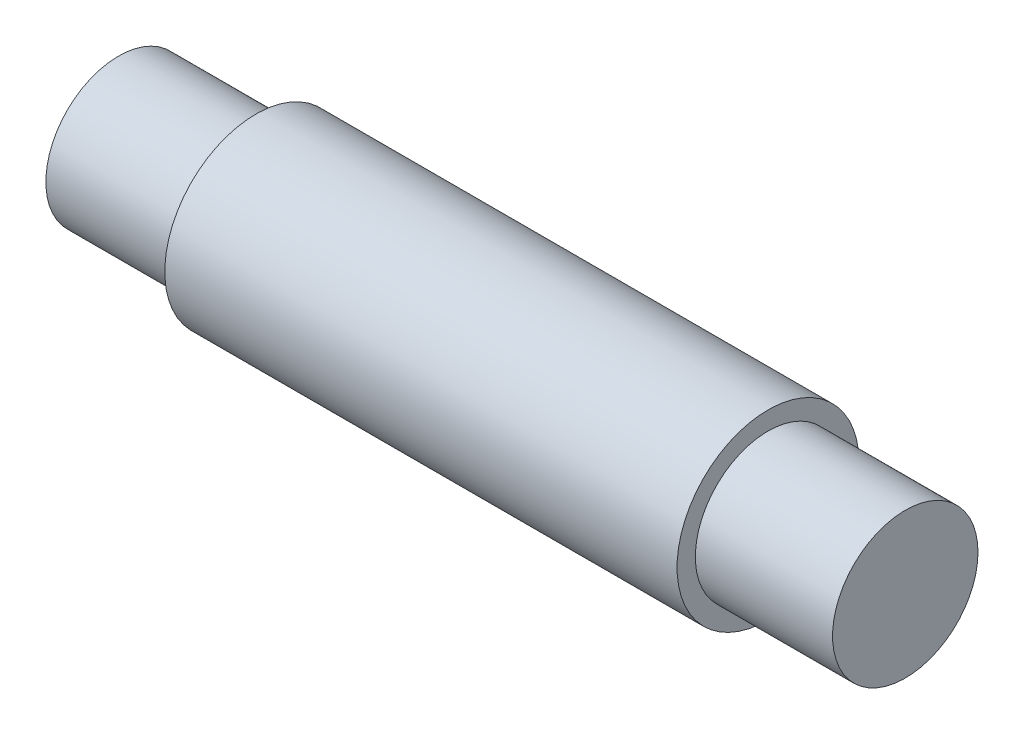
ISO-10303-21;
HEADER;
FILE_DESCRIPTION(('STEP AP214'),'2;1');
FILE_NAME('part.step','',(''),(''),'','','');
FILE_SCHEMA(('AUTOMOTIVE_DESIGN { 1 0 10303 214 1 1 1 1 }'));
ENDSEC;
DATA;
#1=APPLICATION_CONTEXT('core data for automotive mechanical design processes');
#2=APPLICATION_PROTOCOL_DEFINITION('international standard','automotive_design',2000,#1);
#3=PRODUCT_CONTEXT('',#1,'mechanical');
#4=PRODUCT('Part','Part','',(#3));
#5=PRODUCT_RELATED_PRODUCT_CATEGORY('part','',(#4));
#6=PRODUCT_DEFINITION_FORMATION('','',#4);
#7=PRODUCT_DEFINITION_CONTEXT('part definition',#1,'design');
#8=PRODUCT_DEFINITION('design','',#6,#7);
#9=PRODUCT_DEFINITION_SHAPE('','',#8);
#10=(LENGTH_UNIT() NAMED_UNIT(*) SI_UNIT(.MILLI.,.METRE.));
#11=(NAMED_UNIT(*) PLANE_ANGLE_UNIT() SI_UNIT($,.RADIAN.));
#12=(NAMED_UNIT(*) SI_UNIT($,.STERADIAN.) SOLID_ANGLE_UNIT());
#13=UNCERTAINTY_MEASURE_WITH_UNIT(LENGTH_MEASURE(1.E-05),#10,'distance_accuracy_value','');
#14=(GEOMETRIC_REPRESENTATION_CONTEXT(3) GLOBAL_UNCERTAINTY_ASSIGNED_CONTEXT((#13)) GLOBAL_UNIT_ASSIGNED_CONTEXT((#10,
#11,#12)) REPRESENTATION_CONTEXT('',''));
#15=CARTESIAN_POINT('',(0.,0.,0.));
#16=DIRECTION('',(0.,0.,1.));
#17=DIRECTION('',(1.,0.,0.));
#18=AXIS2_PLACEMENT_3D('',#15,#16,#17);
#19=CARTESIAN_POINT('',(-43.,0.,0.));
#20=DIRECTION('',(-1.,0.,0.));
#21=DIRECTION('',(0.,0.,1.));
#22=AXIS2_PLACEMENT_3D('',#19,#20,#21);
#23=PLANE('',#22);
#24=CARTESIAN_POINT('',(-43.,0.,0.));
#25=DIRECTION('',(1.,0.,0.));
#26=DIRECTION('',(0.,0.,-1.));
#27=AXIS2_PLACEMENT_3D('',#24,#25,#26);
#28=CIRCLE('',#27,7.94999999999999);
#29=CARTESIAN_POINT('',(-43.,0.,-7.94999999999999));
#30=VERTEX_POINT('',#29);
#31=EDGE_CURVE('E10',#30,#30,#28,.T.);
#32=ORIENTED_EDGE('',*,*,#31,.F.);
#33=EDGE_LOOP('',(#32));
#34=FACE_BOUND('',#33,.T.);
#35=ADVANCED_FACE('F37',(#34),#23,.T.);
#36=CARTESIAN_POINT('',(64.0222222222222,0.,0.));
#37=DIRECTION('',(1.,0.,0.));
#38=DIRECTION('',(0.,0.,-1.));
#39=AXIS2_PLACEMENT_3D('',#36,#37,#38);
#40=CYLINDRICAL_SURFACE('',#39,7.94999999999999);
#41=ORIENTED_EDGE('',*,*,#31,.T.);
#42=EDGE_LOOP('',(#41));
#43=FACE_BOUND('',#42,.T.);
#44=CARTESIAN_POINT('',(-28.,0.,0.));
#45=DIRECTION('',(1.,0.,0.));
#46=DIRECTION('',(0.,0.,-1.));
#47=AXIS2_PLACEMENT_3D('',#44,#45,#46);
#48=CIRCLE('',#47,7.94999999999999);
#49=CARTESIAN_POINT('',(-28.,0.,-7.94999999999999));
#50=VERTEX_POINT('',#49);
#51=EDGE_CURVE('E43',#50,#50,#48,.T.);
#52=ORIENTED_EDGE('',*,*,#51,.F.);
#53=EDGE_LOOP('',(#52));
#54=FACE_BOUND('',#53,.T.);
#55=ADVANCED_FACE('F79',(#43,#54),#40,.T.);
#56=CARTESIAN_POINT('',(-28.,7.94999999999999,0.));
#57=DIRECTION('',(-1.,0.,0.));
#58=DIRECTION('',(0.,0.,1.));
#59=AXIS2_PLACEMENT_3D('',#56,#57,#58);
#60=PLANE('',#59);
#61=ORIENTED_EDGE('',*,*,#51,.T.);
#62=EDGE_LOOP('',(#61));
#63=FACE_BOUND('',#62,.T.);
#64=CARTESIAN_POINT('',(-28.,0.,0.));
#65=DIRECTION('',(1.,0.,0.));
#66=DIRECTION('',(0.,0.,-1.));
#67=AXIS2_PLACEMENT_3D('',#64,#65,#66);
#68=CIRCLE('',#67,9.94999999999999);
#69=CARTESIAN_POINT('',(-28.,0.,-9.94999999999999));
#70=VERTEX_POINT('',#69);
#71=EDGE_CURVE('E47',#70,#70,#68,.T.);
#72=ORIENTED_EDGE('',*,*,#71,.F.);
#73=EDGE_LOOP('',(#72));
#74=FACE_BOUND('',#73,.T.);
#75=ADVANCED_FACE('F84',(#63,#74),#60,.T.);
#76=CARTESIAN_POINT('',(64.0222222222222,0.,0.));
#77=DIRECTION('',(1.,0.,0.));
#78=DIRECTION('',(0.,0.,-1.));
#79=AXIS2_PLACEMENT_3D('',#76,#77,#78);
#80=CYLINDRICAL_SURFACE('',#79,9.94999999999999);
#81=ORIENTED_EDGE('',*,*,#71,.T.);
#82=EDGE_LOOP('',(#81));
#83=FACE_BOUND('',#82,.T.);
#84=CARTESIAN_POINT('',(28.,0.,0.));
#85=DIRECTION('',(1.,0.,0.));
#86=DIRECTION('',(0.,0.,-1.));
#87=AXIS2_PLACEMENT_3D('',#84,#85,#86);
#88=CIRCLE('',#87,9.94999999999999);
#89=CARTESIAN_POINT('',(28.,0.,-9.94999999999999));
#90=VERTEX_POINT('',#89);
#91=EDGE_CURVE('E51',#90,#90,#88,.T.);
#92=ORIENTED_EDGE('',*,*,#91,.F.);
#93=EDGE_LOOP('',(#92));
#94=FACE_BOUND('',#93,.T.);
#95=ADVANCED_FACE('F75',(#83,#94),#80,.T.);
#96=CARTESIAN_POINT('',(28.,9.94999999999999,0.));
#97=DIRECTION('',(1.,0.,0.));
#98=DIRECTION('',(0.,0.,-1.));
#99=AXIS2_PLACEMENT_3D('',#96,#97,#98);
#100=PLANE('',#99);
#101=ORIENTED_EDGE('',*,*,#91,.T.);
#102=EDGE_LOOP('',(#101));
#103=FACE_BOUND('',#102,.T.);
#104=CARTESIAN_POINT('',(28.,0.,0.));
#105=DIRECTION('',(1.,0.,0.));
#106=DIRECTION('',(0.,0.,-1.));
#107=AXIS2_PLACEMENT_3D('',#104,#105,#106);
#108=CIRCLE('',#107,7.94999999999999);
#109=CARTESIAN_POINT('',(28.,0.,-7.94999999999999));
#110=VERTEX_POINT('',#109);
#111=EDGE_CURVE('E56',#110,#110,#108,.T.);
#112=ORIENTED_EDGE('',*,*,#111,.F.);
#113=EDGE_LOOP('',(#112));
#114=FACE_BOUND('',#113,.T.);
#115=ADVANCED_FACE('F67',(#103,#114),#100,.T.);
#116=CARTESIAN_POINT('',(64.0222222222222,0.,0.));
#117=DIRECTION('',(1.,0.,0.));
#118=DIRECTION('',(0.,0.,-1.));
#119=AXIS2_PLACEMENT_3D('',#116,#117,#118);
#120=CYLINDRICAL_SURFACE('',#119,7.95);
#121=ORIENTED_EDGE('',*,*,#111,.T.);
#122=EDGE_LOOP('',(#121));
#123=FACE_BOUND('',#122,.T.);
#124=CARTESIAN_POINT('',(43.,0.,0.));
#125=DIRECTION('',(1.,0.,0.));
#126=DIRECTION('',(0.,0.,-1.));
#127=AXIS2_PLACEMENT_3D('',#124,#125,#126);
#128=CIRCLE('',#127,7.95000000000001);
#129=CARTESIAN_POINT('',(43.,0.,-7.95000000000001));
#130=VERTEX_POINT('',#129);
#131=EDGE_CURVE('E59',#130,#130,#128,.T.);
#132=ORIENTED_EDGE('',*,*,#131,.F.);
#133=EDGE_LOOP('',(#132));
#134=FACE_BOUND('',#133,.T.);
#135=ADVANCED_FACE('F65',(#123,#134),#120,.T.);
#136=CARTESIAN_POINT('',(43.,7.95000000000001,0.));
#137=DIRECTION('',(1.,0.,0.));
#138=DIRECTION('',(0.,0.,-1.));
#139=AXIS2_PLACEMENT_3D('',#136,#137,#138);
#140=PLANE('',#139);
#141=ORIENTED_EDGE('',*,*,#131,.T.);
#142=EDGE_LOOP('',(#141));
#143=FACE_BOUND('',#142,.T.);
#144=ADVANCED_FACE('F63',(#143),#140,.T.);
#145=CLOSED_SHELL('',(#35,#55,#75,#95,#115,#135,#144));
#146=MANIFOLD_SOLID_BREP('B2',#145);
#147=ADVANCED_BREP_SHAPE_REPRESENTATION('',(#18,#146),#14);
#148=SHAPE_DEFINITION_REPRESENTATION(#9,#147);
ENDSEC;
END-ISO-10303-21;
